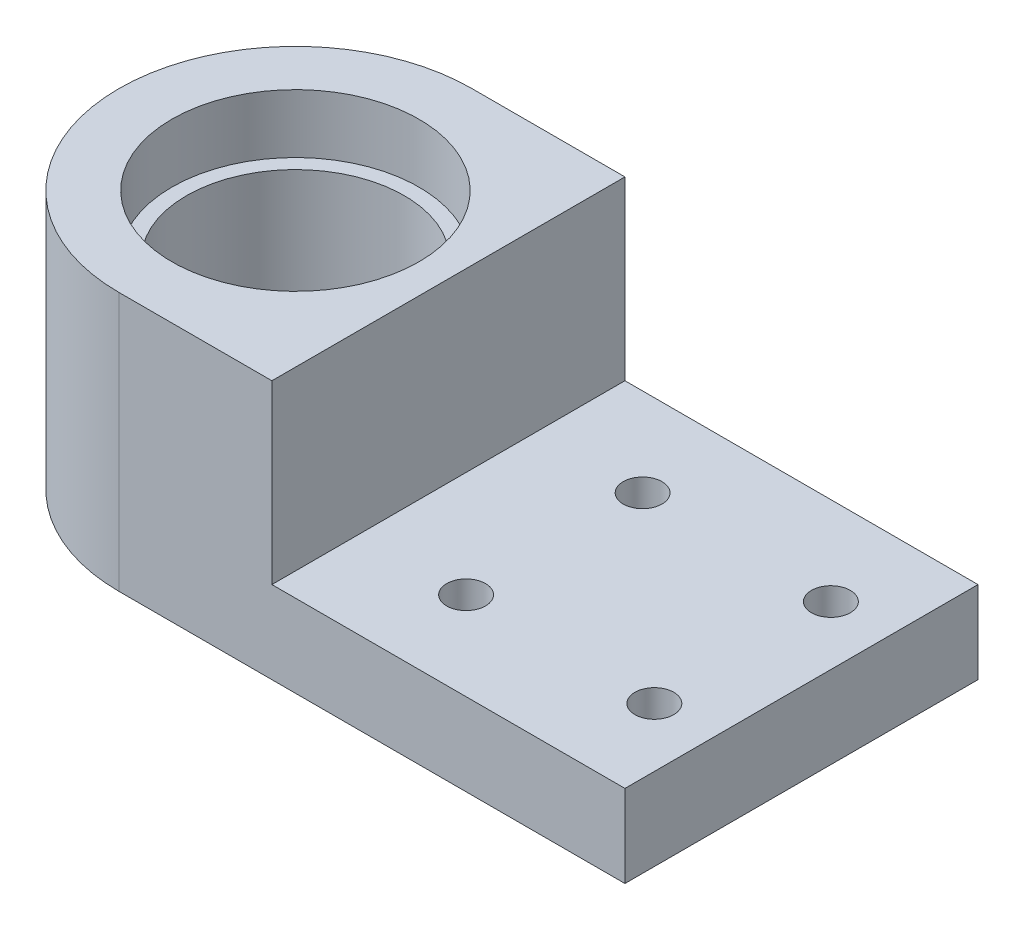
ISO-10303-21;
HEADER;
FILE_DESCRIPTION(('STEP AP214'),'2;1');
FILE_NAME('part.step','',(''),(''),'','','');
FILE_SCHEMA(('AUTOMOTIVE_DESIGN { 1 0 10303 214 1 1 1 1 }'));
ENDSEC;
DATA;
#1=APPLICATION_CONTEXT('core data for automotive mechanical design processes');
#2=APPLICATION_PROTOCOL_DEFINITION('international standard','automotive_design',2000,#1);
#3=PRODUCT_CONTEXT('',#1,'mechanical');
#4=PRODUCT('Part','Part','',(#3));
#5=PRODUCT_RELATED_PRODUCT_CATEGORY('part','',(#4));
#6=PRODUCT_DEFINITION_FORMATION('','',#4);
#7=PRODUCT_DEFINITION_CONTEXT('part definition',#1,'design');
#8=PRODUCT_DEFINITION('design','',#6,#7);
#9=PRODUCT_DEFINITION_SHAPE('','',#8);
#10=(LENGTH_UNIT() NAMED_UNIT(*) SI_UNIT(.MILLI.,.METRE.));
#11=(NAMED_UNIT(*) PLANE_ANGLE_UNIT() SI_UNIT($,.RADIAN.));
#12=(NAMED_UNIT(*) SI_UNIT($,.STERADIAN.) SOLID_ANGLE_UNIT());
#13=UNCERTAINTY_MEASURE_WITH_UNIT(LENGTH_MEASURE(1.E-05),#10,'distance_accuracy_value','');
#14=(GEOMETRIC_REPRESENTATION_CONTEXT(3) GLOBAL_UNCERTAINTY_ASSIGNED_CONTEXT((#13)) GLOBAL_UNIT_ASSIGNED_CONTEXT((#10,
#11,#12)) REPRESENTATION_CONTEXT('',''));
#15=CARTESIAN_POINT('',(0.,0.,0.));
#16=DIRECTION('',(0.,0.,1.));
#17=DIRECTION('',(1.,0.,0.));
#18=AXIS2_PLACEMENT_3D('',#15,#16,#17);
#19=CARTESIAN_POINT('',(0.,0.,60.));
#20=DIRECTION('',(0.,1.,0.));
#21=DIRECTION('',(-1.,0.,0.));
#22=AXIS2_PLACEMENT_3D('',#19,#20,#21);
#23=PLANE('',#22);
#24=CARTESIAN_POINT('',(-9.99999999999999,0.,45.));
#25=DIRECTION('',(0.,-1.,0.));
#26=DIRECTION('',(0.,0.,-1.));
#27=AXIS2_PLACEMENT_3D('',#24,#25,#26);
#28=CIRCLE('',#27,5.5);
#29=CARTESIAN_POINT('',(-9.99999999999999,0.,39.5));
#30=VERTEX_POINT('',#29);
#31=EDGE_CURVE('E480',#30,#30,#28,.T.);
#32=ORIENTED_EDGE('',*,*,#31,.F.);
#33=EDGE_LOOP('',(#32));
#34=FACE_BOUND('',#33,.T.);
#35=CARTESIAN_POINT('',(-42.,0.,15.));
#36=DIRECTION('',(0.,-1.,0.));
#37=DIRECTION('',(0.,0.,-1.));
#38=AXIS2_PLACEMENT_3D('',#35,#36,#37);
#39=CIRCLE('',#38,5.5);
#40=CARTESIAN_POINT('',(-42.,0.,9.5));
#41=VERTEX_POINT('',#40);
#42=EDGE_CURVE('E196',#41,#41,#39,.T.);
#43=ORIENTED_EDGE('',*,*,#42,.F.);
#44=EDGE_LOOP('',(#43));
#45=FACE_BOUND('',#44,.T.);
#46=CARTESIAN_POINT('',(-9.99999999999999,0.,15.));
#47=DIRECTION('',(0.,-1.,0.));
#48=DIRECTION('',(0.,0.,-1.));
#49=AXIS2_PLACEMENT_3D('',#46,#47,#48);
#50=CIRCLE('',#49,5.5);
#51=CARTESIAN_POINT('',(-9.99999999999999,0.,9.5));
#52=VERTEX_POINT('',#51);
#53=EDGE_CURVE('E175',#52,#52,#50,.T.);
#54=ORIENTED_EDGE('',*,*,#53,.F.);
#55=EDGE_LOOP('',(#54));
#56=FACE_BOUND('',#55,.T.);
#57=CARTESIAN_POINT('',(-86.,0.,30.));
#58=DIRECTION('',(0.,1.,0.));
#59=DIRECTION('',(-1.,0.,0.));
#60=AXIS2_PLACEMENT_3D('',#57,#58,#59);
#61=CIRCLE('',#60,18.5);
#62=CARTESIAN_POINT('',(-104.5,0.,30.));
#63=VERTEX_POINT('',#62);
#64=EDGE_CURVE('E166',#63,#63,#61,.T.);
#65=ORIENTED_EDGE('',*,*,#64,.T.);
#66=EDGE_LOOP('',(#65));
#67=FACE_BOUND('',#66,.T.);
#68=DIRECTION('',(1.,0.,0.));
#69=VECTOR('',#68,1.);
#70=CARTESIAN_POINT('',(0.,0.,60.));
#71=LINE('',#70,#69);
#72=CARTESIAN_POINT('',(-86.,0.,60.));
#73=VERTEX_POINT('',#72);
#74=CARTESIAN_POINT('',(0.,0.,60.));
#75=VERTEX_POINT('',#74);
#76=EDGE_CURVE('E126',#73,#75,#71,.T.);
#77=ORIENTED_EDGE('',*,*,#76,.F.);
#78=CARTESIAN_POINT('',(-86.,0.,30.));
#79=DIRECTION('',(0.,1.,0.));
#80=DIRECTION('',(-1.,0.,0.));
#81=AXIS2_PLACEMENT_3D('',#78,#79,#80);
#82=CIRCLE('',#81,30.);
#83=CARTESIAN_POINT('',(-116.,0.,30.));
#84=VERTEX_POINT('',#83);
#85=EDGE_CURVE('E149',#73,#84,#82,.F.);
#86=ORIENTED_EDGE('',*,*,#85,.T.);
#87=CARTESIAN_POINT('',(-86.,0.,30.));
#88=DIRECTION('',(0.,1.,0.));
#89=DIRECTION('',(-1.,0.,0.));
#90=AXIS2_PLACEMENT_3D('',#87,#88,#89);
#91=CIRCLE('',#90,30.);
#92=CARTESIAN_POINT('',(-86.,0.,0.));
#93=VERTEX_POINT('',#92);
#94=EDGE_CURVE('E141',#84,#93,#91,.F.);
#95=ORIENTED_EDGE('',*,*,#94,.T.);
#96=DIRECTION('',(1.,0.,0.));
#97=VECTOR('',#96,1.);
#98=CARTESIAN_POINT('',(0.,0.,0.));
#99=LINE('',#98,#97);
#100=CARTESIAN_POINT('',(0.,0.,0.));
#101=VERTEX_POINT('',#100);
#102=EDGE_CURVE('E131',#93,#101,#99,.T.);
#103=ORIENTED_EDGE('',*,*,#102,.T.);
#104=DIRECTION('',(0.,0.,-1.));
#105=VECTOR('',#104,1.);
#106=CARTESIAN_POINT('',(0.,0.,60.));
#107=LINE('',#106,#105);
#108=EDGE_CURVE('E232',#75,#101,#107,.T.);
#109=ORIENTED_EDGE('',*,*,#108,.F.);
#110=EDGE_LOOP('',(#77,#86,#95,#103,#109));
#111=FACE_BOUND('',#110,.T.);
#112=CARTESIAN_POINT('',(-42.,0.,45.));
#113=DIRECTION('',(0.,-1.,0.));
#114=DIRECTION('',(0.,0.,-1.));
#115=AXIS2_PLACEMENT_3D('',#112,#113,#114);
#116=CIRCLE('',#115,5.5);
#117=CARTESIAN_POINT('',(-42.,0.,39.5));
#118=VERTEX_POINT('',#117);
#119=EDGE_CURVE('E180',#118,#118,#116,.T.);
#120=ORIENTED_EDGE('',*,*,#119,.F.);
#121=EDGE_LOOP('',(#120));
#122=FACE_BOUND('',#121,.T.);
#123=ADVANCED_FACE('F45',(#34,#45,#56,#67,#111,#122),#23,.F.);
#124=CARTESIAN_POINT('',(0.,14.,60.));
#125=DIRECTION('',(-1.,0.,0.));
#126=DIRECTION('',(0.,0.,1.));
#127=AXIS2_PLACEMENT_3D('',#124,#125,#126);
#128=PLANE('',#127);
#129=DIRECTION('',(0.,1.,0.));
#130=VECTOR('',#129,1.);
#131=CARTESIAN_POINT('',(0.,14.,0.));
#132=LINE('',#131,#130);
#133=CARTESIAN_POINT('',(0.,14.,0.));
#134=VERTEX_POINT('',#133);
#135=EDGE_CURVE('E135',#101,#134,#132,.T.);
#136=ORIENTED_EDGE('',*,*,#135,.T.);
#137=DIRECTION('',(0.,0.,-1.));
#138=VECTOR('',#137,1.);
#139=CARTESIAN_POINT('',(0.,14.,60.));
#140=LINE('',#139,#138);
#141=CARTESIAN_POINT('',(0.,14.,60.));
#142=VERTEX_POINT('',#141);
#143=EDGE_CURVE('E111',#142,#134,#140,.T.);
#144=ORIENTED_EDGE('',*,*,#143,.F.);
#145=DIRECTION('',(0.,1.,0.));
#146=VECTOR('',#145,1.);
#147=CARTESIAN_POINT('',(0.,14.,60.));
#148=LINE('',#147,#146);
#149=EDGE_CURVE('E119',#75,#142,#148,.T.);
#150=ORIENTED_EDGE('',*,*,#149,.F.);
#151=ORIENTED_EDGE('',*,*,#108,.T.);
#152=EDGE_LOOP('',(#136,#144,#150,#151));
#153=FACE_BOUND('',#152,.T.);
#154=ADVANCED_FACE('F133',(#153),#128,.F.);
#155=CARTESIAN_POINT('',(-60.,14.,60.));
#156=DIRECTION('',(0.,-1.,0.));
#157=DIRECTION('',(0.,0.,-1.));
#158=AXIS2_PLACEMENT_3D('',#155,#156,#157);
#159=PLANE('',#158);
#160=CARTESIAN_POINT('',(-9.99999999999999,14.,45.));
#161=DIRECTION('',(0.,-1.,0.));
#162=DIRECTION('',(0.,0.,-1.));
#163=AXIS2_PLACEMENT_3D('',#160,#161,#162);
#164=CIRCLE('',#163,3.3);
#165=CARTESIAN_POINT('',(-9.99999999999999,14.,41.7));
#166=VERTEX_POINT('',#165);
#167=EDGE_CURVE('E49',#166,#166,#164,.T.);
#168=ORIENTED_EDGE('',*,*,#167,.T.);
#169=EDGE_LOOP('',(#168));
#170=FACE_BOUND('',#169,.T.);
#171=CARTESIAN_POINT('',(-42.,14.,15.));
#172=DIRECTION('',(0.,-1.,0.));
#173=DIRECTION('',(0.,0.,-1.));
#174=AXIS2_PLACEMENT_3D('',#171,#172,#173);
#175=CIRCLE('',#174,3.3);
#176=CARTESIAN_POINT('',(-42.,14.,11.7));
#177=VERTEX_POINT('',#176);
#178=EDGE_CURVE('E177',#177,#177,#175,.T.);
#179=ORIENTED_EDGE('',*,*,#178,.T.);
#180=EDGE_LOOP('',(#179));
#181=FACE_BOUND('',#180,.T.);
#182=CARTESIAN_POINT('',(-42.,14.,45.));
#183=DIRECTION('',(0.,-1.,0.));
#184=DIRECTION('',(0.,0.,-1.));
#185=AXIS2_PLACEMENT_3D('',#182,#183,#184);
#186=CIRCLE('',#185,3.3);
#187=CARTESIAN_POINT('',(-42.,14.,41.7));
#188=VERTEX_POINT('',#187);
#189=EDGE_CURVE('E172',#188,#188,#186,.T.);
#190=ORIENTED_EDGE('',*,*,#189,.T.);
#191=EDGE_LOOP('',(#190));
#192=FACE_BOUND('',#191,.T.);
#193=CARTESIAN_POINT('',(-9.99999999999999,14.,15.));
#194=DIRECTION('',(0.,-1.,0.));
#195=DIRECTION('',(0.,0.,-1.));
#196=AXIS2_PLACEMENT_3D('',#193,#194,#195);
#197=CIRCLE('',#196,3.3);
#198=CARTESIAN_POINT('',(-9.99999999999999,14.,11.7));
#199=VERTEX_POINT('',#198);
#200=EDGE_CURVE('E167',#199,#199,#197,.T.);
#201=ORIENTED_EDGE('',*,*,#200,.T.);
#202=EDGE_LOOP('',(#201));
#203=FACE_BOUND('',#202,.T.);
#204=DIRECTION('',(-1.,0.,0.));
#205=VECTOR('',#204,1.);
#206=CARTESIAN_POINT('',(-60.,14.,0.));
#207=LINE('',#206,#205);
#208=CARTESIAN_POINT('',(-60.,14.,0.));
#209=VERTEX_POINT('',#208);
#210=EDGE_CURVE('E235',#134,#209,#207,.T.);
#211=ORIENTED_EDGE('',*,*,#210,.T.);
#212=DIRECTION('',(0.,0.,-1.));
#213=VECTOR('',#212,1.);
#214=CARTESIAN_POINT('',(-60.,14.,60.));
#215=LINE('',#214,#213);
#216=CARTESIAN_POINT('',(-60.,14.,60.));
#217=VERTEX_POINT('',#216);
#218=EDGE_CURVE('E114',#217,#209,#215,.T.);
#219=ORIENTED_EDGE('',*,*,#218,.F.);
#220=DIRECTION('',(-1.,0.,0.));
#221=VECTOR('',#220,1.);
#222=CARTESIAN_POINT('',(-60.,14.,60.));
#223=LINE('',#222,#221);
#224=EDGE_CURVE('E107',#142,#217,#223,.T.);
#225=ORIENTED_EDGE('',*,*,#224,.F.);
#226=ORIENTED_EDGE('',*,*,#143,.T.);
#227=EDGE_LOOP('',(#211,#219,#225,#226));
#228=FACE_BOUND('',#227,.T.);
#229=ADVANCED_FACE('F109',(#170,#181,#192,#203,#228),#159,.F.);
#230=CARTESIAN_POINT('',(-60.,44.,60.));
#231=DIRECTION('',(-1.,0.,0.));
#232=DIRECTION('',(0.,0.,1.));
#233=AXIS2_PLACEMENT_3D('',#230,#231,#232);
#234=PLANE('',#233);
#235=DIRECTION('',(0.,1.,0.));
#236=VECTOR('',#235,1.);
#237=CARTESIAN_POINT('',(-60.,44.,0.));
#238=LINE('',#237,#236);
#239=CARTESIAN_POINT('',(-60.,44.,0.));
#240=VERTEX_POINT('',#239);
#241=EDGE_CURVE('E238',#209,#240,#238,.T.);
#242=ORIENTED_EDGE('',*,*,#241,.T.);
#243=DIRECTION('',(0.,0.,-1.));
#244=VECTOR('',#243,1.);
#245=CARTESIAN_POINT('',(-60.,44.,60.));
#246=LINE('',#245,#244);
#247=CARTESIAN_POINT('',(-60.,44.,60.));
#248=VERTEX_POINT('',#247);
#249=EDGE_CURVE('E143',#248,#240,#246,.T.);
#250=ORIENTED_EDGE('',*,*,#249,.F.);
#251=DIRECTION('',(0.,1.,0.));
#252=VECTOR('',#251,1.);
#253=CARTESIAN_POINT('',(-60.,44.,60.));
#254=LINE('',#253,#252);
#255=EDGE_CURVE('E118',#217,#248,#254,.T.);
#256=ORIENTED_EDGE('',*,*,#255,.F.);
#257=ORIENTED_EDGE('',*,*,#218,.T.);
#258=EDGE_LOOP('',(#242,#250,#256,#257));
#259=FACE_BOUND('',#258,.T.);
#260=ADVANCED_FACE('F255',(#259),#234,.F.);
#261=CARTESIAN_POINT('',(-116.,44.,60.));
#262=DIRECTION('',(0.,-1.,0.));
#263=DIRECTION('',(0.,0.,-1.));
#264=AXIS2_PLACEMENT_3D('',#261,#262,#263);
#265=PLANE('',#264);
#266=CARTESIAN_POINT('',(-86.,44.,30.));
#267=DIRECTION('',(0.,1.,0.));
#268=DIRECTION('',(-1.,0.,0.));
#269=AXIS2_PLACEMENT_3D('',#266,#267,#268);
#270=CIRCLE('',#269,21.);
#271=CARTESIAN_POINT('',(-107.,44.,30.));
#272=VERTEX_POINT('',#271);
#273=EDGE_CURVE('E165',#272,#272,#270,.T.);
#274=ORIENTED_EDGE('',*,*,#273,.F.);
#275=EDGE_LOOP('',(#274));
#276=FACE_BOUND('',#275,.T.);
#277=CARTESIAN_POINT('',(-86.,44.,30.));
#278=DIRECTION('',(0.,-1.,0.));
#279=DIRECTION('',(0.,0.,-1.));
#280=AXIS2_PLACEMENT_3D('',#277,#278,#279);
#281=CIRCLE('',#280,30.);
#282=CARTESIAN_POINT('',(-86.,44.,0.));
#283=VERTEX_POINT('',#282);
#284=CARTESIAN_POINT('',(-116.,44.,30.));
#285=VERTEX_POINT('',#284);
#286=EDGE_CURVE('E63',#283,#285,#281,.F.);
#287=ORIENTED_EDGE('',*,*,#286,.T.);
#288=CARTESIAN_POINT('',(-86.,44.,30.));
#289=DIRECTION('',(0.,-1.,0.));
#290=DIRECTION('',(0.,0.,-1.));
#291=AXIS2_PLACEMENT_3D('',#288,#289,#290);
#292=CIRCLE('',#291,30.);
#293=CARTESIAN_POINT('',(-86.,44.,60.));
#294=VERTEX_POINT('',#293);
#295=EDGE_CURVE('E55',#285,#294,#292,.F.);
#296=ORIENTED_EDGE('',*,*,#295,.T.);
#297=DIRECTION('',(-1.,0.,0.));
#298=VECTOR('',#297,1.);
#299=CARTESIAN_POINT('',(-116.,44.,60.));
#300=LINE('',#299,#298);
#301=EDGE_CURVE('E227',#248,#294,#300,.T.);
#302=ORIENTED_EDGE('',*,*,#301,.F.);
#303=ORIENTED_EDGE('',*,*,#249,.T.);
#304=DIRECTION('',(-1.,0.,0.));
#305=VECTOR('',#304,1.);
#306=CARTESIAN_POINT('',(-116.,44.,0.));
#307=LINE('',#306,#305);
#308=EDGE_CURVE('E241',#240,#283,#307,.T.);
#309=ORIENTED_EDGE('',*,*,#308,.T.);
#310=EDGE_LOOP('',(#287,#296,#302,#303,#309));
#311=FACE_BOUND('',#310,.T.);
#312=ADVANCED_FACE('F251',(#276,#311),#265,.F.);
#313=CARTESIAN_POINT('',(0.,0.,60.));
#314=DIRECTION('',(0.,0.,-1.));
#315=DIRECTION('',(-1.,0.,0.));
#316=AXIS2_PLACEMENT_3D('',#313,#314,#315);
#317=PLANE('',#316);
#318=ORIENTED_EDGE('',*,*,#301,.T.);
#319=DIRECTION('',(0.,-1.,0.));
#320=VECTOR('',#319,1.);
#321=CARTESIAN_POINT('',(-86.,0.,60.));
#322=LINE('',#321,#320);
#323=EDGE_CURVE('E137',#294,#73,#322,.T.);
#324=ORIENTED_EDGE('',*,*,#323,.T.);
#325=ORIENTED_EDGE('',*,*,#76,.T.);
#326=ORIENTED_EDGE('',*,*,#149,.T.);
#327=ORIENTED_EDGE('',*,*,#224,.T.);
#328=ORIENTED_EDGE('',*,*,#255,.T.);
#329=EDGE_LOOP('',(#318,#324,#325,#326,#327,#328));
#330=FACE_BOUND('',#329,.T.);
#331=ADVANCED_FACE('F123',(#330),#317,.F.);
#332=CARTESIAN_POINT('',(0.,0.,0.));
#333=DIRECTION('',(0.,0.,-1.));
#334=DIRECTION('',(-1.,0.,0.));
#335=AXIS2_PLACEMENT_3D('',#332,#333,#334);
#336=PLANE('',#335);
#337=ORIENTED_EDGE('',*,*,#102,.F.);
#338=DIRECTION('',(0.,-1.,0.));
#339=VECTOR('',#338,1.);
#340=CARTESIAN_POINT('',(-86.,44.,0.));
#341=LINE('',#340,#339);
#342=EDGE_CURVE('E11',#93,#283,#341,.F.);
#343=ORIENTED_EDGE('',*,*,#342,.T.);
#344=ORIENTED_EDGE('',*,*,#308,.F.);
#345=ORIENTED_EDGE('',*,*,#241,.F.);
#346=ORIENTED_EDGE('',*,*,#210,.F.);
#347=ORIENTED_EDGE('',*,*,#135,.F.);
#348=EDGE_LOOP('',(#337,#343,#344,#345,#346,#347));
#349=FACE_BOUND('',#348,.T.);
#350=ADVANCED_FACE('F254',(#349),#336,.T.);
#351=CARTESIAN_POINT('',(-86.,0.,30.));
#352=DIRECTION('',(0.,1.,0.));
#353=DIRECTION('',(0.,0.,1.));
#354=AXIS2_PLACEMENT_3D('',#351,#352,#353);
#355=CYLINDRICAL_SURFACE('',#354,30.);
#356=DIRECTION('',(0.,-1.,0.));
#357=VECTOR('',#356,1.);
#358=CARTESIAN_POINT('',(-116.,0.,30.));
#359=LINE('',#358,#357);
#360=EDGE_CURVE('E156',#285,#84,#359,.T.);
#361=ORIENTED_EDGE('',*,*,#360,.F.);
#362=ORIENTED_EDGE('',*,*,#286,.F.);
#363=ORIENTED_EDGE('',*,*,#342,.F.);
#364=ORIENTED_EDGE('',*,*,#94,.F.);
#365=EDGE_LOOP('',(#361,#362,#363,#364));
#366=FACE_BOUND('',#365,.T.);
#367=ADVANCED_FACE('F47',(#366),#355,.T.);
#368=CARTESIAN_POINT('',(-86.,0.,30.));
#369=DIRECTION('',(0.,-1.,0.));
#370=DIRECTION('',(0.,0.,-1.));
#371=AXIS2_PLACEMENT_3D('',#368,#369,#370);
#372=CYLINDRICAL_SURFACE('',#371,30.);
#373=ORIENTED_EDGE('',*,*,#295,.F.);
#374=ORIENTED_EDGE('',*,*,#360,.T.);
#375=ORIENTED_EDGE('',*,*,#85,.F.);
#376=ORIENTED_EDGE('',*,*,#323,.F.);
#377=EDGE_LOOP('',(#373,#374,#375,#376));
#378=FACE_BOUND('',#377,.T.);
#379=ADVANCED_FACE('F259',(#378),#372,.T.);
#380=CARTESIAN_POINT('',(-86.,34.,30.));
#381=DIRECTION('',(0.,1.,0.));
#382=DIRECTION('',(-1.,0.,0.));
#383=AXIS2_PLACEMENT_3D('',#380,#381,#382);
#384=CYLINDRICAL_SURFACE('',#383,21.);
#385=CARTESIAN_POINT('',(-86.,34.,30.));
#386=DIRECTION('',(0.,1.,0.));
#387=DIRECTION('',(-1.,0.,0.));
#388=AXIS2_PLACEMENT_3D('',#385,#386,#387);
#389=CIRCLE('',#388,21.);
#390=CARTESIAN_POINT('',(-107.,34.,30.));
#391=VERTEX_POINT('',#390);
#392=EDGE_CURVE('E160',#391,#391,#389,.T.);
#393=ORIENTED_EDGE('',*,*,#392,.F.);
#394=EDGE_LOOP('',(#393));
#395=FACE_BOUND('',#394,.T.);
#396=ORIENTED_EDGE('',*,*,#273,.T.);
#397=EDGE_LOOP('',(#396));
#398=FACE_BOUND('',#397,.T.);
#399=ADVANCED_FACE('F269',(#395,#398),#384,.F.);
#400=CARTESIAN_POINT('',(-86.,34.,30.));
#401=DIRECTION('',(0.,1.,0.));
#402=DIRECTION('',(-1.,0.,0.));
#403=AXIS2_PLACEMENT_3D('',#400,#401,#402);
#404=PLANE('',#403);
#405=CARTESIAN_POINT('',(-86.,34.,30.));
#406=DIRECTION('',(0.,1.,0.));
#407=DIRECTION('',(-1.,0.,0.));
#408=AXIS2_PLACEMENT_3D('',#405,#406,#407);
#409=CIRCLE('',#408,18.5);
#410=CARTESIAN_POINT('',(-104.5,34.,30.));
#411=VERTEX_POINT('',#410);
#412=EDGE_CURVE('E161',#411,#411,#409,.T.);
#413=ORIENTED_EDGE('',*,*,#412,.F.);
#414=EDGE_LOOP('',(#413));
#415=FACE_BOUND('',#414,.T.);
#416=ORIENTED_EDGE('',*,*,#392,.T.);
#417=EDGE_LOOP('',(#416));
#418=FACE_BOUND('',#417,.T.);
#419=ADVANCED_FACE('F311',(#415,#418),#404,.T.);
#420=CARTESIAN_POINT('',(-86.,0.,30.));
#421=DIRECTION('',(0.,1.,0.));
#422=DIRECTION('',(-1.,0.,0.));
#423=AXIS2_PLACEMENT_3D('',#420,#421,#422);
#424=CYLINDRICAL_SURFACE('',#423,18.5);
#425=ORIENTED_EDGE('',*,*,#412,.T.);
#426=EDGE_LOOP('',(#425));
#427=FACE_BOUND('',#426,.T.);
#428=ORIENTED_EDGE('',*,*,#64,.F.);
#429=EDGE_LOOP('',(#428));
#430=FACE_BOUND('',#429,.T.);
#431=ADVANCED_FACE('F302',(#427,#430),#424,.F.);
#432=CARTESIAN_POINT('',(-9.99999999999999,0.,15.));
#433=DIRECTION('',(0.,-1.,0.));
#434=DIRECTION('',(0.,0.,-1.));
#435=AXIS2_PLACEMENT_3D('',#432,#433,#434);
#436=CYLINDRICAL_SURFACE('',#435,3.3);
#437=CARTESIAN_POINT('',(-9.99999999999999,6.8,15.));
#438=DIRECTION('',(0.,-1.,0.));
#439=DIRECTION('',(0.,0.,-1.));
#440=AXIS2_PLACEMENT_3D('',#437,#438,#439);
#441=CIRCLE('',#440,3.3);
#442=CARTESIAN_POINT('',(-9.99999999999999,6.8,11.7));
#443=VERTEX_POINT('',#442);
#444=EDGE_CURVE('E171',#443,#443,#441,.T.);
#445=ORIENTED_EDGE('',*,*,#444,.T.);
#446=EDGE_LOOP('',(#445));
#447=FACE_BOUND('',#446,.T.);
#448=ORIENTED_EDGE('',*,*,#200,.F.);
#449=EDGE_LOOP('',(#448));
#450=FACE_BOUND('',#449,.T.);
#451=ADVANCED_FACE('F300',(#447,#450),#436,.F.);
#452=CARTESIAN_POINT('',(-6.69999999999999,6.8,15.));
#453=DIRECTION('',(0.,1.,0.));
#454=DIRECTION('',(0.,0.,1.));
#455=AXIS2_PLACEMENT_3D('',#452,#453,#454);
#456=PLANE('',#455);
#457=ORIENTED_EDGE('',*,*,#444,.F.);
#458=EDGE_LOOP('',(#457));
#459=FACE_BOUND('',#458,.T.);
#460=CARTESIAN_POINT('',(-9.99999999999999,6.8,15.));
#461=DIRECTION('',(0.,-1.,0.));
#462=DIRECTION('',(0.,0.,-1.));
#463=AXIS2_PLACEMENT_3D('',#460,#461,#462);
#464=CIRCLE('',#463,5.5);
#465=CARTESIAN_POINT('',(-9.99999999999999,6.8,9.5));
#466=VERTEX_POINT('',#465);
#467=EDGE_CURVE('E209',#466,#466,#464,.T.);
#468=ORIENTED_EDGE('',*,*,#467,.T.);
#469=EDGE_LOOP('',(#468));
#470=FACE_BOUND('',#469,.T.);
#471=ADVANCED_FACE('F301',(#459,#470),#456,.F.);
#472=CARTESIAN_POINT('',(-9.99999999999999,0.,15.));
#473=DIRECTION('',(0.,-1.,0.));
#474=DIRECTION('',(0.,0.,-1.));
#475=AXIS2_PLACEMENT_3D('',#472,#473,#474);
#476=CYLINDRICAL_SURFACE('',#475,5.5);
#477=ORIENTED_EDGE('',*,*,#467,.F.);
#478=EDGE_LOOP('',(#477));
#479=FACE_BOUND('',#478,.T.);
#480=ORIENTED_EDGE('',*,*,#53,.T.);
#481=EDGE_LOOP('',(#480));
#482=FACE_BOUND('',#481,.T.);
#483=ADVANCED_FACE('F308',(#479,#482),#476,.F.);
#484=CARTESIAN_POINT('',(-42.,0.,45.));
#485=DIRECTION('',(0.,-1.,0.));
#486=DIRECTION('',(0.,0.,-1.));
#487=AXIS2_PLACEMENT_3D('',#484,#485,#486);
#488=CYLINDRICAL_SURFACE('',#487,3.3);
#489=CARTESIAN_POINT('',(-42.,6.79999999999999,45.));
#490=DIRECTION('',(0.,-1.,0.));
#491=DIRECTION('',(0.,0.,-1.));
#492=AXIS2_PLACEMENT_3D('',#489,#490,#491);
#493=CIRCLE('',#492,3.3);
#494=CARTESIAN_POINT('',(-42.,6.79999999999999,41.7));
#495=VERTEX_POINT('',#494);
#496=EDGE_CURVE('E176',#495,#495,#493,.T.);
#497=ORIENTED_EDGE('',*,*,#496,.T.);
#498=EDGE_LOOP('',(#497));
#499=FACE_BOUND('',#498,.T.);
#500=ORIENTED_EDGE('',*,*,#189,.F.);
#501=EDGE_LOOP('',(#500));
#502=FACE_BOUND('',#501,.T.);
#503=ADVANCED_FACE('F384',(#499,#502),#488,.F.);
#504=CARTESIAN_POINT('',(-38.7,6.79999999999999,45.));
#505=DIRECTION('',(0.,1.,0.));
#506=DIRECTION('',(0.,0.,1.));
#507=AXIS2_PLACEMENT_3D('',#504,#505,#506);
#508=PLANE('',#507);
#509=ORIENTED_EDGE('',*,*,#496,.F.);
#510=EDGE_LOOP('',(#509));
#511=FACE_BOUND('',#510,.T.);
#512=CARTESIAN_POINT('',(-42.,6.79999999999999,45.));
#513=DIRECTION('',(0.,-1.,0.));
#514=DIRECTION('',(0.,0.,-1.));
#515=AXIS2_PLACEMENT_3D('',#512,#513,#514);
#516=CIRCLE('',#515,5.5);
#517=CARTESIAN_POINT('',(-42.,6.79999999999999,39.5));
#518=VERTEX_POINT('',#517);
#519=EDGE_CURVE('E187',#518,#518,#516,.T.);
#520=ORIENTED_EDGE('',*,*,#519,.T.);
#521=EDGE_LOOP('',(#520));
#522=FACE_BOUND('',#521,.T.);
#523=ADVANCED_FACE('F393',(#511,#522),#508,.F.);
#524=CARTESIAN_POINT('',(-42.,0.,45.));
#525=DIRECTION('',(0.,-1.,0.));
#526=DIRECTION('',(0.,0.,-1.));
#527=AXIS2_PLACEMENT_3D('',#524,#525,#526);
#528=CYLINDRICAL_SURFACE('',#527,5.5);
#529=ORIENTED_EDGE('',*,*,#519,.F.);
#530=EDGE_LOOP('',(#529));
#531=FACE_BOUND('',#530,.T.);
#532=ORIENTED_EDGE('',*,*,#119,.T.);
#533=EDGE_LOOP('',(#532));
#534=FACE_BOUND('',#533,.T.);
#535=ADVANCED_FACE('F403',(#531,#534),#528,.F.);
#536=CARTESIAN_POINT('',(-42.,0.,15.));
#537=DIRECTION('',(0.,-1.,0.));
#538=DIRECTION('',(0.,0.,-1.));
#539=AXIS2_PLACEMENT_3D('',#536,#537,#538);
#540=CYLINDRICAL_SURFACE('',#539,3.3);
#541=CARTESIAN_POINT('',(-42.,6.79999999999999,15.));
#542=DIRECTION('',(0.,-1.,0.));
#543=DIRECTION('',(0.,0.,-1.));
#544=AXIS2_PLACEMENT_3D('',#541,#542,#543);
#545=CIRCLE('',#544,3.3);
#546=CARTESIAN_POINT('',(-42.,6.79999999999999,11.7));
#547=VERTEX_POINT('',#546);
#548=EDGE_CURVE('E181',#547,#547,#545,.T.);
#549=ORIENTED_EDGE('',*,*,#548,.T.);
#550=EDGE_LOOP('',(#549));
#551=FACE_BOUND('',#550,.T.);
#552=ORIENTED_EDGE('',*,*,#178,.F.);
#553=EDGE_LOOP('',(#552));
#554=FACE_BOUND('',#553,.T.);
#555=ADVANCED_FACE('F413',(#551,#554),#540,.F.);
#556=CARTESIAN_POINT('',(-38.7,6.79999999999999,15.));
#557=DIRECTION('',(0.,1.,0.));
#558=DIRECTION('',(0.,0.,1.));
#559=AXIS2_PLACEMENT_3D('',#556,#557,#558);
#560=PLANE('',#559);
#561=ORIENTED_EDGE('',*,*,#548,.F.);
#562=EDGE_LOOP('',(#561));
#563=FACE_BOUND('',#562,.T.);
#564=CARTESIAN_POINT('',(-42.,6.79999999999999,15.));
#565=DIRECTION('',(0.,-1.,0.));
#566=DIRECTION('',(0.,0.,-1.));
#567=AXIS2_PLACEMENT_3D('',#564,#565,#566);
#568=CIRCLE('',#567,5.5);
#569=CARTESIAN_POINT('',(-42.,6.79999999999999,9.5));
#570=VERTEX_POINT('',#569);
#571=EDGE_CURVE('E190',#570,#570,#568,.T.);
#572=ORIENTED_EDGE('',*,*,#571,.T.);
#573=EDGE_LOOP('',(#572));
#574=FACE_BOUND('',#573,.T.);
#575=ADVANCED_FACE('F423',(#563,#574),#560,.F.);
#576=CARTESIAN_POINT('',(-42.,0.,15.));
#577=DIRECTION('',(0.,-1.,0.));
#578=DIRECTION('',(0.,0.,-1.));
#579=AXIS2_PLACEMENT_3D('',#576,#577,#578);
#580=CYLINDRICAL_SURFACE('',#579,5.5);
#581=ORIENTED_EDGE('',*,*,#571,.F.);
#582=EDGE_LOOP('',(#581));
#583=FACE_BOUND('',#582,.T.);
#584=ORIENTED_EDGE('',*,*,#42,.T.);
#585=EDGE_LOOP('',(#584));
#586=FACE_BOUND('',#585,.T.);
#587=ADVANCED_FACE('F432',(#583,#586),#580,.F.);
#588=CARTESIAN_POINT('',(-9.99999999999999,0.,45.));
#589=DIRECTION('',(0.,-1.,0.));
#590=DIRECTION('',(0.,0.,-1.));
#591=AXIS2_PLACEMENT_3D('',#588,#589,#590);
#592=CYLINDRICAL_SURFACE('',#591,3.3);
#593=CARTESIAN_POINT('',(-9.99999999999999,6.8,45.));
#594=DIRECTION('',(0.,-1.,0.));
#595=DIRECTION('',(0.,0.,-1.));
#596=AXIS2_PLACEMENT_3D('',#593,#594,#595);
#597=CIRCLE('',#596,3.3);
#598=CARTESIAN_POINT('',(-9.99999999999999,6.8,41.7));
#599=VERTEX_POINT('',#598);
#600=EDGE_CURVE('E484',#599,#599,#597,.T.);
#601=ORIENTED_EDGE('',*,*,#600,.T.);
#602=EDGE_LOOP('',(#601));
#603=FACE_BOUND('',#602,.T.);
#604=ORIENTED_EDGE('',*,*,#167,.F.);
#605=EDGE_LOOP('',(#604));
#606=FACE_BOUND('',#605,.T.);
#607=ADVANCED_FACE('F442',(#603,#606),#592,.F.);
#608=CARTESIAN_POINT('',(-6.69999999999999,6.8,45.));
#609=DIRECTION('',(0.,1.,0.));
#610=DIRECTION('',(0.,0.,1.));
#611=AXIS2_PLACEMENT_3D('',#608,#609,#610);
#612=PLANE('',#611);
#613=ORIENTED_EDGE('',*,*,#600,.F.);
#614=EDGE_LOOP('',(#613));
#615=FACE_BOUND('',#614,.T.);
#616=CARTESIAN_POINT('',(-9.99999999999999,6.8,45.));
#617=DIRECTION('',(0.,-1.,0.));
#618=DIRECTION('',(0.,0.,-1.));
#619=AXIS2_PLACEMENT_3D('',#616,#617,#618);
#620=CIRCLE('',#619,5.5);
#621=CARTESIAN_POINT('',(-9.99999999999999,6.8,39.5));
#622=VERTEX_POINT('',#621);
#623=EDGE_CURVE('E478',#622,#622,#620,.T.);
#624=ORIENTED_EDGE('',*,*,#623,.T.);
#625=EDGE_LOOP('',(#624));
#626=FACE_BOUND('',#625,.T.);
#627=ADVANCED_FACE('F452',(#615,#626),#612,.F.);
#628=CARTESIAN_POINT('',(-9.99999999999999,0.,45.));
#629=DIRECTION('',(0.,-1.,0.));
#630=DIRECTION('',(0.,0.,-1.));
#631=AXIS2_PLACEMENT_3D('',#628,#629,#630);
#632=CYLINDRICAL_SURFACE('',#631,5.5);
#633=ORIENTED_EDGE('',*,*,#623,.F.);
#634=EDGE_LOOP('',(#633));
#635=FACE_BOUND('',#634,.T.);
#636=ORIENTED_EDGE('',*,*,#31,.T.);
#637=EDGE_LOOP('',(#636));
#638=FACE_BOUND('',#637,.T.);
#639=ADVANCED_FACE('F462',(#635,#638),#632,.F.);
#640=CLOSED_SHELL('',(#123,#154,#229,#260,#312,#331,#350,#367,#379,#399,#419,#431,#451,#471,
#483,#503,#523,#535,#555,#575,#587,#607,#627,#639));
#641=MANIFOLD_SOLID_BREP('B2',#640);
#642=ADVANCED_BREP_SHAPE_REPRESENTATION('',(#18,#641),#14);
#643=SHAPE_DEFINITION_REPRESENTATION(#9,#642);
ENDSEC;
END-ISO-10303-21;
